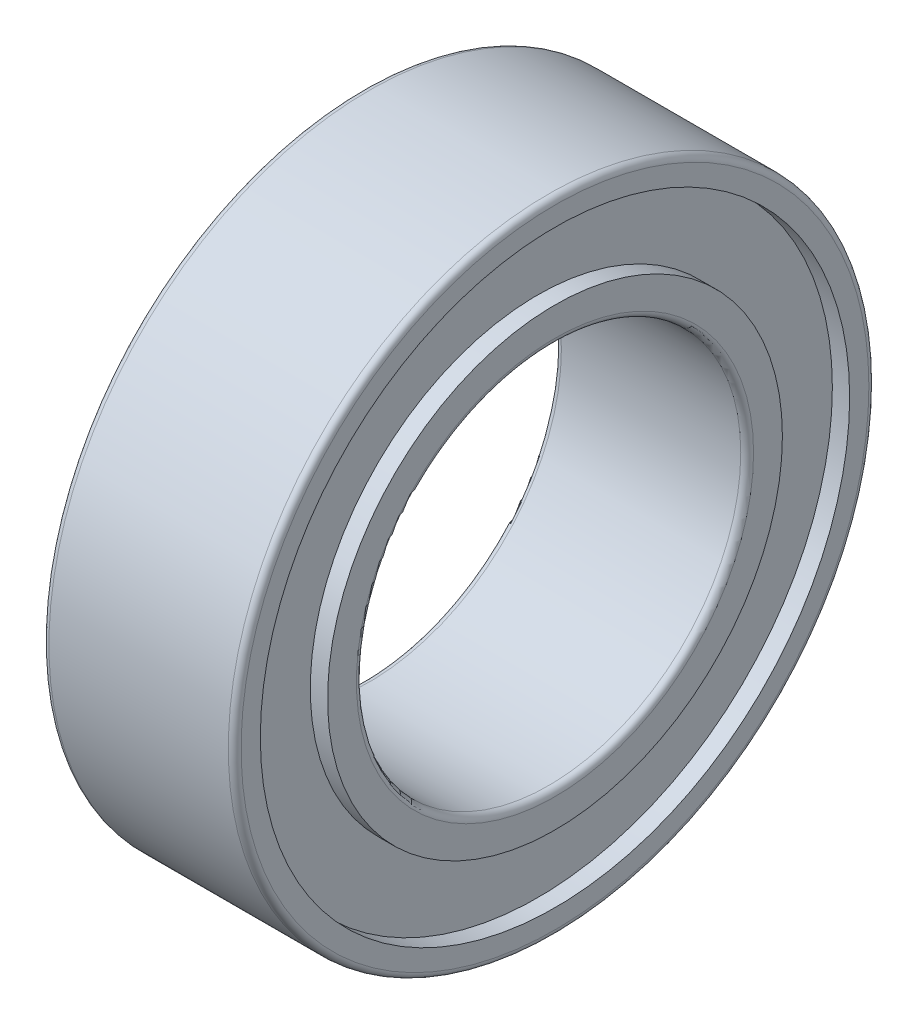
ISO-10303-21;
HEADER;
FILE_DESCRIPTION(('STEP AP214'),'2;1');
FILE_NAME('part.step','',(''),(''),'','','');
FILE_SCHEMA(('AUTOMOTIVE_DESIGN { 1 0 10303 214 1 1 1 1 }'));
ENDSEC;
DATA;
#1=APPLICATION_CONTEXT('core data for automotive mechanical design processes');
#2=APPLICATION_PROTOCOL_DEFINITION('international standard','automotive_design',2000,#1);
#3=PRODUCT_CONTEXT('',#1,'mechanical');
#4=PRODUCT('Part','Part','',(#3));
#5=PRODUCT_RELATED_PRODUCT_CATEGORY('part','',(#4));
#6=PRODUCT_DEFINITION_FORMATION('','',#4);
#7=PRODUCT_DEFINITION_CONTEXT('part definition',#1,'design');
#8=PRODUCT_DEFINITION('design','',#6,#7);
#9=PRODUCT_DEFINITION_SHAPE('','',#8);
#10=(LENGTH_UNIT() NAMED_UNIT(*) SI_UNIT(.MILLI.,.METRE.));
#11=(NAMED_UNIT(*) PLANE_ANGLE_UNIT() SI_UNIT($,.RADIAN.));
#12=(NAMED_UNIT(*) SI_UNIT($,.STERADIAN.) SOLID_ANGLE_UNIT());
#13=UNCERTAINTY_MEASURE_WITH_UNIT(LENGTH_MEASURE(1.E-05),#10,'distance_accuracy_value','');
#14=(GEOMETRIC_REPRESENTATION_CONTEXT(3) GLOBAL_UNCERTAINTY_ASSIGNED_CONTEXT((#13)) GLOBAL_UNIT_ASSIGNED_CONTEXT((#10,
#11,#12)) REPRESENTATION_CONTEXT('',''));
#15=CARTESIAN_POINT('',(0.,0.,0.));
#16=DIRECTION('',(0.,0.,1.));
#17=DIRECTION('',(1.,0.,0.));
#18=AXIS2_PLACEMENT_3D('',#15,#16,#17);
#19=CARTESIAN_POINT('',(0.,3.55,0.));
#20=DIRECTION('',(-1.,0.,0.));
#21=DIRECTION('',(0.,0.,1.));
#22=AXIS2_PLACEMENT_3D('',#19,#20,#21);
#23=PLANE('',#22);
#24=CARTESIAN_POINT('',(0.,0.,0.));
#25=DIRECTION('',(1.,0.,0.));
#26=DIRECTION('',(0.,0.,-1.));
#27=AXIS2_PLACEMENT_3D('',#24,#25,#26);
#28=CIRCLE('',#27,3.09999999999993);
#29=CARTESIAN_POINT('',(0.,0.,-3.09999999999993));
#30=VERTEX_POINT('',#29);
#31=EDGE_CURVE('E68',#30,#30,#28,.T.);
#32=ORIENTED_EDGE('',*,*,#31,.T.);
#33=EDGE_LOOP('',(#32));
#34=FACE_BOUND('',#33,.T.);
#35=CARTESIAN_POINT('',(0.,0.,0.));
#36=DIRECTION('',(1.,0.,0.));
#37=DIRECTION('',(0.,0.,-1.));
#38=AXIS2_PLACEMENT_3D('',#35,#36,#37);
#39=CIRCLE('',#38,3.55);
#40=CARTESIAN_POINT('',(0.,0.,-3.55));
#41=VERTEX_POINT('',#40);
#42=EDGE_CURVE('E65',#41,#41,#39,.T.);
#43=ORIENTED_EDGE('',*,*,#42,.F.);
#44=EDGE_LOOP('',(#43));
#45=FACE_BOUND('',#44,.T.);
#46=ADVANCED_FACE('F15',(#34,#45),#23,.T.);
#47=CARTESIAN_POINT('',(0.099999999999923,0.,0.));
#48=DIRECTION('',(1.,0.,0.));
#49=DIRECTION('',(0.,0.,-1.));
#50=AXIS2_PLACEMENT_3D('',#47,#48,#49);
#51=TOROIDAL_SURFACE('',#50,3.09999999999993,0.099999999999923);
#52=CARTESIAN_POINT('',(0.1,0.,0.));
#53=DIRECTION('',(1.,0.,0.));
#54=DIRECTION('',(0.,0.,-1.));
#55=AXIS2_PLACEMENT_3D('',#52,#53,#54);
#56=CIRCLE('',#55,3.);
#57=CARTESIAN_POINT('',(0.1,0.,-3.));
#58=VERTEX_POINT('',#57);
#59=EDGE_CURVE('E62',#58,#58,#56,.T.);
#60=ORIENTED_EDGE('',*,*,#59,.T.);
#61=EDGE_LOOP('',(#60));
#62=FACE_BOUND('',#61,.T.);
#63=ORIENTED_EDGE('',*,*,#31,.F.);
#64=EDGE_LOOP('',(#63));
#65=FACE_BOUND('',#64,.T.);
#66=ADVANCED_FACE('F74',(#62,#65),#51,.T.);
#67=CARTESIAN_POINT('',(2.9,0.,0.));
#68=DIRECTION('',(1.,0.,0.));
#69=DIRECTION('',(0.,0.,-1.));
#70=AXIS2_PLACEMENT_3D('',#67,#68,#69);
#71=CYLINDRICAL_SURFACE('',#70,3.55);
#72=ORIENTED_EDGE('',*,*,#42,.T.);
#73=EDGE_LOOP('',(#72));
#74=FACE_BOUND('',#73,.T.);
#75=CARTESIAN_POINT('',(0.27,0.,0.));
#76=DIRECTION('',(1.,0.,0.));
#77=DIRECTION('',(0.,0.,-1.));
#78=AXIS2_PLACEMENT_3D('',#75,#76,#77);
#79=CIRCLE('',#78,3.55);
#80=CARTESIAN_POINT('',(0.27,0.,-3.55));
#81=VERTEX_POINT('',#80);
#82=EDGE_CURVE('E59',#81,#81,#79,.T.);
#83=ORIENTED_EDGE('',*,*,#82,.F.);
#84=EDGE_LOOP('',(#83));
#85=FACE_BOUND('',#84,.T.);
#86=ADVANCED_FACE('F76',(#74,#85),#71,.T.);
#87=CARTESIAN_POINT('',(2.9,0.,0.));
#88=DIRECTION('',(1.,0.,0.));
#89=DIRECTION('',(0.,0.,-1.));
#90=AXIS2_PLACEMENT_3D('',#87,#88,#89);
#91=CYLINDRICAL_SURFACE('',#90,3.);
#92=CARTESIAN_POINT('',(2.9,0.,0.));
#93=DIRECTION('',(1.,0.,0.));
#94=DIRECTION('',(0.,0.,-1.));
#95=AXIS2_PLACEMENT_3D('',#92,#93,#94);
#96=CIRCLE('',#95,3.);
#97=CARTESIAN_POINT('',(2.9,0.,-3.));
#98=VERTEX_POINT('',#97);
#99=EDGE_CURVE('E56',#98,#98,#96,.T.);
#100=ORIENTED_EDGE('',*,*,#99,.T.);
#101=EDGE_LOOP('',(#100));
#102=FACE_BOUND('',#101,.T.);
#103=ORIENTED_EDGE('',*,*,#59,.F.);
#104=EDGE_LOOP('',(#103));
#105=FACE_BOUND('',#104,.T.);
#106=ADVANCED_FACE('F84',(#102,#105),#91,.F.);
#107=CARTESIAN_POINT('',(0.27,4.6,0.));
#108=DIRECTION('',(-1.,0.,0.));
#109=DIRECTION('',(0.,0.,1.));
#110=AXIS2_PLACEMENT_3D('',#107,#108,#109);
#111=PLANE('',#110);
#112=ORIENTED_EDGE('',*,*,#82,.T.);
#113=EDGE_LOOP('',(#112));
#114=FACE_BOUND('',#113,.T.);
#115=CARTESIAN_POINT('',(0.27,0.,0.));
#116=DIRECTION('',(1.,0.,0.));
#117=DIRECTION('',(0.,0.,-1.));
#118=AXIS2_PLACEMENT_3D('',#115,#116,#117);
#119=CIRCLE('',#118,4.6);
#120=CARTESIAN_POINT('',(0.27,0.,-4.6));
#121=VERTEX_POINT('',#120);
#122=EDGE_CURVE('E53',#121,#121,#119,.T.);
#123=ORIENTED_EDGE('',*,*,#122,.F.);
#124=EDGE_LOOP('',(#123));
#125=FACE_BOUND('',#124,.T.);
#126=ADVANCED_FACE('F91',(#114,#125),#111,.T.);
#127=CARTESIAN_POINT('',(2.90000000000015,0.,0.));
#128=DIRECTION('',(1.,0.,0.));
#129=DIRECTION('',(0.,0.,-1.));
#130=AXIS2_PLACEMENT_3D('',#127,#128,#129);
#131=TOROIDAL_SURFACE('',#130,3.09999999999985,0.0999999999998467);
#132=CARTESIAN_POINT('',(3.,0.,0.));
#133=DIRECTION('',(1.,0.,0.));
#134=DIRECTION('',(0.,0.,-1.));
#135=AXIS2_PLACEMENT_3D('',#132,#133,#134);
#136=CIRCLE('',#135,3.10000001788124);
#137=CARTESIAN_POINT('',(3.,0.,-3.10000001788124));
#138=VERTEX_POINT('',#137);
#139=EDGE_CURVE('E50',#138,#138,#136,.T.);
#140=ORIENTED_EDGE('',*,*,#139,.T.);
#141=EDGE_LOOP('',(#140));
#142=FACE_BOUND('',#141,.T.);
#143=ORIENTED_EDGE('',*,*,#99,.F.);
#144=EDGE_LOOP('',(#143));
#145=FACE_BOUND('',#144,.T.);
#146=ADVANCED_FACE('F95',(#142,#145),#131,.T.);
#147=CARTESIAN_POINT('',(2.9,0.,0.));
#148=DIRECTION('',(1.,0.,0.));
#149=DIRECTION('',(0.,0.,-1.));
#150=AXIS2_PLACEMENT_3D('',#147,#148,#149);
#151=CYLINDRICAL_SURFACE('',#150,4.6);
#152=ORIENTED_EDGE('',*,*,#122,.T.);
#153=EDGE_LOOP('',(#152));
#154=FACE_BOUND('',#153,.T.);
#155=CARTESIAN_POINT('',(0.,0.,0.));
#156=DIRECTION('',(1.,0.,0.));
#157=DIRECTION('',(0.,0.,-1.));
#158=AXIS2_PLACEMENT_3D('',#155,#156,#157);
#159=CIRCLE('',#158,4.6);
#160=CARTESIAN_POINT('',(0.,0.,-4.6));
#161=VERTEX_POINT('',#160);
#162=EDGE_CURVE('E47',#161,#161,#159,.T.);
#163=ORIENTED_EDGE('',*,*,#162,.F.);
#164=EDGE_LOOP('',(#163));
#165=FACE_BOUND('',#164,.T.);
#166=ADVANCED_FACE('F99',(#154,#165),#151,.F.);
#167=CARTESIAN_POINT('',(3.,3.1,0.));
#168=DIRECTION('',(1.,0.,0.));
#169=DIRECTION('',(0.,0.,-1.));
#170=AXIS2_PLACEMENT_3D('',#167,#168,#169);
#171=PLANE('',#170);
#172=CARTESIAN_POINT('',(3.,0.,0.));
#173=DIRECTION('',(1.,0.,0.));
#174=DIRECTION('',(0.,0.,-1.));
#175=AXIS2_PLACEMENT_3D('',#172,#173,#174);
#176=CIRCLE('',#175,3.55);
#177=CARTESIAN_POINT('',(3.,0.,-3.55));
#178=VERTEX_POINT('',#177);
#179=EDGE_CURVE('E44',#178,#178,#176,.T.);
#180=ORIENTED_EDGE('',*,*,#179,.T.);
#181=EDGE_LOOP('',(#180));
#182=FACE_BOUND('',#181,.T.);
#183=ORIENTED_EDGE('',*,*,#139,.F.);
#184=EDGE_LOOP('',(#183));
#185=FACE_BOUND('',#184,.T.);
#186=ADVANCED_FACE('F103',(#182,#185),#171,.T.);
#187=CARTESIAN_POINT('',(0.,4.9,0.));
#188=DIRECTION('',(-1.,0.,0.));
#189=DIRECTION('',(0.,0.,1.));
#190=AXIS2_PLACEMENT_3D('',#187,#188,#189);
#191=PLANE('',#190);
#192=ORIENTED_EDGE('',*,*,#162,.T.);
#193=EDGE_LOOP('',(#192));
#194=FACE_BOUND('',#193,.T.);
#195=CARTESIAN_POINT('',(0.,0.,0.));
#196=DIRECTION('',(1.,0.,0.));
#197=DIRECTION('',(0.,0.,-1.));
#198=AXIS2_PLACEMENT_3D('',#195,#196,#197);
#199=CIRCLE('',#198,4.89999999578539);
#200=CARTESIAN_POINT('',(0.,0.,-4.89999999578539));
#201=VERTEX_POINT('',#200);
#202=EDGE_CURVE('E41',#201,#201,#199,.T.);
#203=ORIENTED_EDGE('',*,*,#202,.F.);
#204=EDGE_LOOP('',(#203));
#205=FACE_BOUND('',#204,.T.);
#206=ADVANCED_FACE('F107',(#194,#205),#191,.T.);
#207=CARTESIAN_POINT('',(2.9,0.,0.));
#208=DIRECTION('',(1.,0.,0.));
#209=DIRECTION('',(0.,0.,-1.));
#210=AXIS2_PLACEMENT_3D('',#207,#208,#209);
#211=CYLINDRICAL_SURFACE('',#210,3.55);
#212=CARTESIAN_POINT('',(2.73,0.,0.));
#213=DIRECTION('',(1.,0.,0.));
#214=DIRECTION('',(0.,0.,-1.));
#215=AXIS2_PLACEMENT_3D('',#212,#213,#214);
#216=CIRCLE('',#215,3.55);
#217=CARTESIAN_POINT('',(2.73,0.,-3.55));
#218=VERTEX_POINT('',#217);
#219=EDGE_CURVE('E38',#218,#218,#216,.T.);
#220=ORIENTED_EDGE('',*,*,#219,.T.);
#221=EDGE_LOOP('',(#220));
#222=FACE_BOUND('',#221,.T.);
#223=ORIENTED_EDGE('',*,*,#179,.F.);
#224=EDGE_LOOP('',(#223));
#225=FACE_BOUND('',#224,.T.);
#226=ADVANCED_FACE('F111',(#222,#225),#211,.T.);
#227=CARTESIAN_POINT('',(0.0999999999999217,0.,0.));
#228=DIRECTION('',(1.,0.,0.));
#229=DIRECTION('',(0.,0.,-1.));
#230=AXIS2_PLACEMENT_3D('',#227,#228,#229);
#231=TOROIDAL_SURFACE('',#230,4.90000000000008,0.0999999999999222);
#232=ORIENTED_EDGE('',*,*,#202,.T.);
#233=EDGE_LOOP('',(#232));
#234=FACE_BOUND('',#233,.T.);
#235=CARTESIAN_POINT('',(0.1,0.,0.));
#236=DIRECTION('',(1.,0.,0.));
#237=DIRECTION('',(0.,0.,-1.));
#238=AXIS2_PLACEMENT_3D('',#235,#236,#237);
#239=CIRCLE('',#238,5.);
#240=CARTESIAN_POINT('',(0.1,0.,-5.));
#241=VERTEX_POINT('',#240);
#242=EDGE_CURVE('E35',#241,#241,#239,.T.);
#243=ORIENTED_EDGE('',*,*,#242,.F.);
#244=EDGE_LOOP('',(#243));
#245=FACE_BOUND('',#244,.T.);
#246=ADVANCED_FACE('F115',(#234,#245),#231,.T.);
#247=CARTESIAN_POINT('',(2.73,3.55,0.));
#248=DIRECTION('',(1.,0.,0.));
#249=DIRECTION('',(0.,0.,-1.));
#250=AXIS2_PLACEMENT_3D('',#247,#248,#249);
#251=PLANE('',#250);
#252=CARTESIAN_POINT('',(2.73,0.,0.));
#253=DIRECTION('',(1.,0.,0.));
#254=DIRECTION('',(0.,0.,-1.));
#255=AXIS2_PLACEMENT_3D('',#252,#253,#254);
#256=CIRCLE('',#255,4.6);
#257=CARTESIAN_POINT('',(2.73,0.,-4.6));
#258=VERTEX_POINT('',#257);
#259=EDGE_CURVE('E30',#258,#258,#256,.T.);
#260=ORIENTED_EDGE('',*,*,#259,.T.);
#261=EDGE_LOOP('',(#260));
#262=FACE_BOUND('',#261,.T.);
#263=ORIENTED_EDGE('',*,*,#219,.F.);
#264=EDGE_LOOP('',(#263));
#265=FACE_BOUND('',#264,.T.);
#266=ADVANCED_FACE('F119',(#262,#265),#251,.T.);
#267=CARTESIAN_POINT('',(2.9,0.,0.));
#268=DIRECTION('',(1.,0.,0.));
#269=DIRECTION('',(0.,0.,-1.));
#270=AXIS2_PLACEMENT_3D('',#267,#268,#269);
#271=CYLINDRICAL_SURFACE('',#270,5.);
#272=ORIENTED_EDGE('',*,*,#242,.T.);
#273=EDGE_LOOP('',(#272));
#274=FACE_BOUND('',#273,.T.);
#275=CARTESIAN_POINT('',(2.9,0.,0.));
#276=DIRECTION('',(1.,0.,0.));
#277=DIRECTION('',(0.,0.,-1.));
#278=AXIS2_PLACEMENT_3D('',#275,#276,#277);
#279=CIRCLE('',#278,5.);
#280=CARTESIAN_POINT('',(2.9,0.,-5.));
#281=VERTEX_POINT('',#280);
#282=EDGE_CURVE('E26',#281,#281,#279,.T.);
#283=ORIENTED_EDGE('',*,*,#282,.F.);
#284=EDGE_LOOP('',(#283));
#285=FACE_BOUND('',#284,.T.);
#286=ADVANCED_FACE('F123',(#274,#285),#271,.T.);
#287=CARTESIAN_POINT('',(2.9,0.,0.));
#288=DIRECTION('',(1.,0.,0.));
#289=DIRECTION('',(0.,0.,-1.));
#290=AXIS2_PLACEMENT_3D('',#287,#288,#289);
#291=CYLINDRICAL_SURFACE('',#290,4.6);
#292=CARTESIAN_POINT('',(3.,0.,0.));
#293=DIRECTION('',(1.,0.,0.));
#294=DIRECTION('',(0.,0.,-1.));
#295=AXIS2_PLACEMENT_3D('',#292,#293,#294);
#296=CIRCLE('',#295,4.6);
#297=CARTESIAN_POINT('',(3.,0.,-4.6));
#298=VERTEX_POINT('',#297);
#299=EDGE_CURVE('E22',#298,#298,#296,.T.);
#300=ORIENTED_EDGE('',*,*,#299,.T.);
#301=EDGE_LOOP('',(#300));
#302=FACE_BOUND('',#301,.T.);
#303=ORIENTED_EDGE('',*,*,#259,.F.);
#304=EDGE_LOOP('',(#303));
#305=FACE_BOUND('',#304,.T.);
#306=ADVANCED_FACE('F127',(#302,#305),#291,.F.);
#307=CARTESIAN_POINT('',(2.90000000000015,0.,0.));
#308=DIRECTION('',(1.,0.,0.));
#309=DIRECTION('',(0.,0.,-1.));
#310=AXIS2_PLACEMENT_3D('',#307,#308,#309);
#311=TOROIDAL_SURFACE('',#310,4.90000000000016,0.099999999999845);
#312=ORIENTED_EDGE('',*,*,#282,.T.);
#313=EDGE_LOOP('',(#312));
#314=FACE_BOUND('',#313,.T.);
#315=CARTESIAN_POINT('',(3.,0.,0.));
#316=DIRECTION('',(1.,0.,0.));
#317=DIRECTION('',(0.,0.,-1.));
#318=AXIS2_PLACEMENT_3D('',#315,#316,#317);
#319=CIRCLE('',#318,4.90000000000016);
#320=CARTESIAN_POINT('',(3.,0.,-4.90000000000016));
#321=VERTEX_POINT('',#320);
#322=EDGE_CURVE('E10',#321,#321,#319,.T.);
#323=ORIENTED_EDGE('',*,*,#322,.F.);
#324=EDGE_LOOP('',(#323));
#325=FACE_BOUND('',#324,.T.);
#326=ADVANCED_FACE('F130',(#314,#325),#311,.T.);
#327=CARTESIAN_POINT('',(3.,4.6,0.));
#328=DIRECTION('',(1.,0.,0.));
#329=DIRECTION('',(0.,0.,-1.));
#330=AXIS2_PLACEMENT_3D('',#327,#328,#329);
#331=PLANE('',#330);
#332=ORIENTED_EDGE('',*,*,#322,.T.);
#333=EDGE_LOOP('',(#332));
#334=FACE_BOUND('',#333,.T.);
#335=ORIENTED_EDGE('',*,*,#299,.F.);
#336=EDGE_LOOP('',(#335));
#337=FACE_BOUND('',#336,.T.);
#338=ADVANCED_FACE('F17',(#334,#337),#331,.T.);
#339=CLOSED_SHELL('',(#46,#66,#86,#106,#126,#146,#166,#186,#206,#226,#246,#266,#286,#306,#326,#338));
#340=MANIFOLD_SOLID_BREP('B1',#339);
#341=ADVANCED_BREP_SHAPE_REPRESENTATION('',(#18,#340),#14);
#342=SHAPE_DEFINITION_REPRESENTATION(#9,#341);
ENDSEC;
END-ISO-10303-21;
